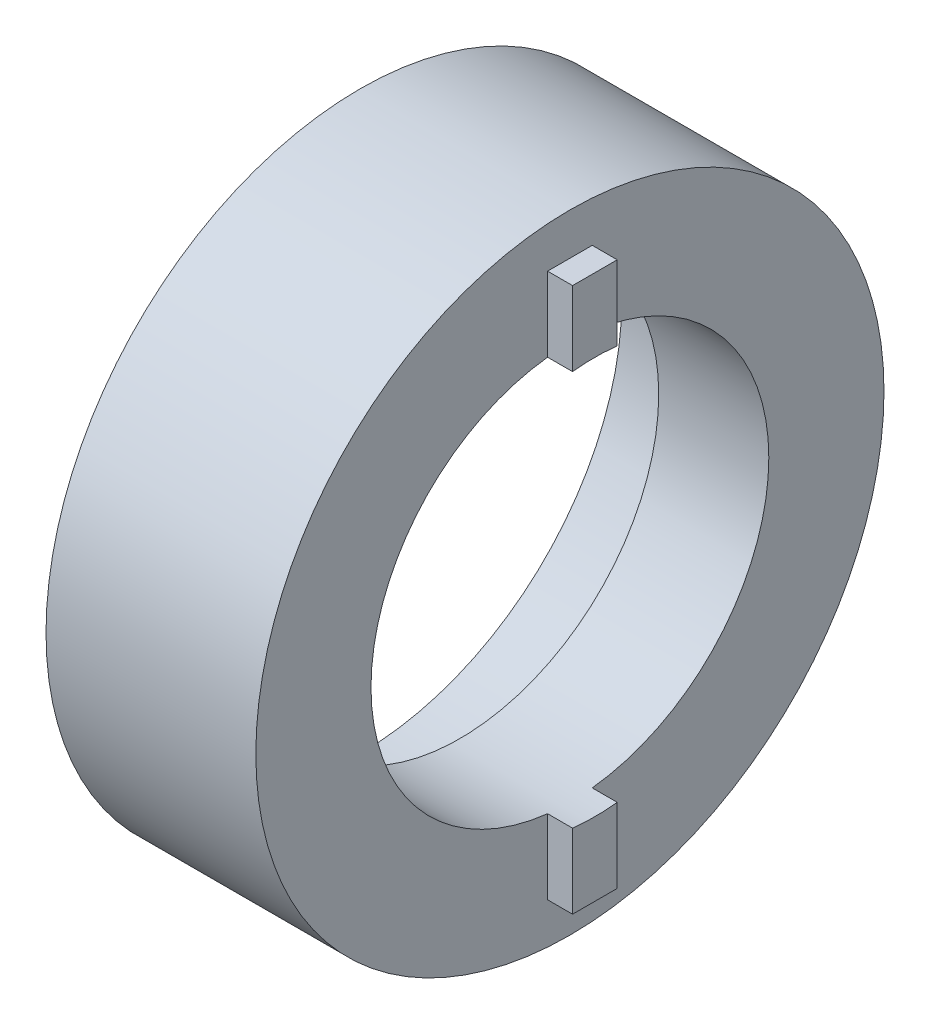
ISO-10303-21;
HEADER;
FILE_DESCRIPTION(('STEP AP214'),'2;1');
FILE_NAME('part.step','',(''),(''),'','','');
FILE_SCHEMA(('AUTOMOTIVE_DESIGN { 1 0 10303 214 1 1 1 1 }'));
ENDSEC;
DATA;
#1=APPLICATION_CONTEXT('core data for automotive mechanical design processes');
#2=APPLICATION_PROTOCOL_DEFINITION('international standard','automotive_design',2000,#1);
#3=PRODUCT_CONTEXT('',#1,'mechanical');
#4=PRODUCT('Part','Part','',(#3));
#5=PRODUCT_RELATED_PRODUCT_CATEGORY('part','',(#4));
#6=PRODUCT_DEFINITION_FORMATION('','',#4);
#7=PRODUCT_DEFINITION_CONTEXT('part definition',#1,'design');
#8=PRODUCT_DEFINITION('design','',#6,#7);
#9=PRODUCT_DEFINITION_SHAPE('','',#8);
#10=(LENGTH_UNIT() NAMED_UNIT(*) SI_UNIT(.MILLI.,.METRE.));
#11=(NAMED_UNIT(*) PLANE_ANGLE_UNIT() SI_UNIT($,.RADIAN.));
#12=(NAMED_UNIT(*) SI_UNIT($,.STERADIAN.) SOLID_ANGLE_UNIT());
#13=UNCERTAINTY_MEASURE_WITH_UNIT(LENGTH_MEASURE(1.E-05),#10,'distance_accuracy_value','');
#14=(GEOMETRIC_REPRESENTATION_CONTEXT(3) GLOBAL_UNCERTAINTY_ASSIGNED_CONTEXT((#13)) GLOBAL_UNIT_ASSIGNED_CONTEXT((#10,
#11,#12)) REPRESENTATION_CONTEXT('',''));
#15=CARTESIAN_POINT('',(0.,0.,0.));
#16=DIRECTION('',(0.,0.,1.));
#17=DIRECTION('',(1.,0.,0.));
#18=AXIS2_PLACEMENT_3D('',#15,#16,#17);
#19=CARTESIAN_POINT('',(22.4282,26.,2.1336));
#20=DIRECTION('',(0.,0.,-1.));
#21=DIRECTION('',(0.,1.,0.));
#22=AXIS2_PLACEMENT_3D('',#19,#20,#21);
#23=PLANE('',#22);
#24=DIRECTION('',(0.,-1.,0.));
#25=VECTOR('',#24,1.);
#26=CARTESIAN_POINT('',(22.4282,26.,2.1336));
#27=LINE('',#26,#25);
#28=CARTESIAN_POINT('',(22.4282,-18.8798239144331,2.1336));
#29=VERTEX_POINT('',#28);
#30=CARTESIAN_POINT('',(22.4282,-26.,2.1336));
#31=VERTEX_POINT('',#30);
#32=EDGE_CURVE('E128',#29,#31,#27,.T.);
#33=ORIENTED_EDGE('',*,*,#32,.F.);
#34=DIRECTION('',(-1.,0.,0.));
#35=VECTOR('',#34,1.);
#36=CARTESIAN_POINT('',(22.4282,-18.8798239144331,2.1336));
#37=LINE('',#36,#35);
#38=CARTESIAN_POINT('',(20.0406,-18.8798239144331,2.1336));
#39=VERTEX_POINT('',#38);
#40=EDGE_CURVE('E53',#29,#39,#37,.T.);
#41=ORIENTED_EDGE('',*,*,#40,.T.);
#42=DIRECTION('',(0.,-1.,0.));
#43=VECTOR('',#42,1.);
#44=CARTESIAN_POINT('',(20.0406,26.,2.1336));
#45=LINE('',#44,#43);
#46=CARTESIAN_POINT('',(20.0406,-26.,2.1336));
#47=VERTEX_POINT('',#46);
#48=EDGE_CURVE('E144',#39,#47,#45,.T.);
#49=ORIENTED_EDGE('',*,*,#48,.T.);
#50=DIRECTION('',(-1.,0.,0.));
#51=VECTOR('',#50,1.);
#52=CARTESIAN_POINT('',(22.4282,-26.,2.1336));
#53=LINE('',#52,#51);
#54=EDGE_CURVE('E156',#31,#47,#53,.T.);
#55=ORIENTED_EDGE('',*,*,#54,.F.);
#56=EDGE_LOOP('',(#33,#41,#49,#55));
#57=FACE_BOUND('',#56,.T.);
#58=ADVANCED_FACE('F38',(#57),#23,.F.);
#59=CARTESIAN_POINT('',(22.4282,26.,-2.1336));
#60=DIRECTION('',(0.,0.,1.));
#61=DIRECTION('',(0.,-1.,0.));
#62=AXIS2_PLACEMENT_3D('',#59,#60,#61);
#63=PLANE('',#62);
#64=DIRECTION('',(0.,1.,0.));
#65=VECTOR('',#64,1.);
#66=CARTESIAN_POINT('',(22.4282,26.,-2.1336));
#67=LINE('',#66,#65);
#68=CARTESIAN_POINT('',(22.4282,18.8798239144331,-2.1336));
#69=VERTEX_POINT('',#68);
#70=CARTESIAN_POINT('',(22.4282,26.,-2.1336));
#71=VERTEX_POINT('',#70);
#72=EDGE_CURVE('E130',#69,#71,#67,.T.);
#73=ORIENTED_EDGE('',*,*,#72,.F.);
#74=DIRECTION('',(-1.,0.,0.));
#75=VECTOR('',#74,1.);
#76=CARTESIAN_POINT('',(22.4282,18.8798239144331,-2.1336));
#77=LINE('',#76,#75);
#78=CARTESIAN_POINT('',(20.0406,18.8798239144331,-2.1336));
#79=VERTEX_POINT('',#78);
#80=EDGE_CURVE('E107',#69,#79,#77,.T.);
#81=ORIENTED_EDGE('',*,*,#80,.T.);
#82=DIRECTION('',(0.,1.,0.));
#83=VECTOR('',#82,1.);
#84=CARTESIAN_POINT('',(20.0406,26.,-2.1336));
#85=LINE('',#84,#83);
#86=CARTESIAN_POINT('',(20.0406,26.,-2.1336));
#87=VERTEX_POINT('',#86);
#88=EDGE_CURVE('E60',#79,#87,#85,.T.);
#89=ORIENTED_EDGE('',*,*,#88,.T.);
#90=DIRECTION('',(-1.,0.,0.));
#91=VECTOR('',#90,1.);
#92=CARTESIAN_POINT('',(22.4282,26.,-2.1336));
#93=LINE('',#92,#91);
#94=EDGE_CURVE('E151',#71,#87,#93,.T.);
#95=ORIENTED_EDGE('',*,*,#94,.F.);
#96=EDGE_LOOP('',(#73,#81,#89,#95));
#97=FACE_BOUND('',#96,.T.);
#98=ADVANCED_FACE('F187',(#97),#63,.F.);
#99=CARTESIAN_POINT('',(22.4282,-26.,2.1336));
#100=DIRECTION('',(-1.,0.,0.));
#101=DIRECTION('',(0.,0.,1.));
#102=AXIS2_PLACEMENT_3D('',#99,#100,#101);
#103=PLANE('',#102);
#104=CARTESIAN_POINT('',(22.4282,26.,2.1336));
#105=VERTEX_POINT('',#104);
#106=CARTESIAN_POINT('',(22.4282,18.8798239144331,2.1336));
#107=VERTEX_POINT('',#106);
#108=EDGE_CURVE('E118',#105,#107,#27,.T.);
#109=ORIENTED_EDGE('',*,*,#108,.T.);
#110=CARTESIAN_POINT('',(22.4282,0.,0.));
#111=DIRECTION('',(-1.,0.,0.));
#112=DIRECTION('',(0.,0.,1.));
#113=AXIS2_PLACEMENT_3D('',#110,#111,#112);
#114=CIRCLE('',#113,19.);
#115=EDGE_CURVE('E102',#107,#69,#114,.T.);
#116=ORIENTED_EDGE('',*,*,#115,.T.);
#117=ORIENTED_EDGE('',*,*,#72,.T.);
#118=DIRECTION('',(0.,0.,1.));
#119=VECTOR('',#118,1.);
#120=CARTESIAN_POINT('',(22.4282,26.,-2.1336));
#121=LINE('',#120,#119);
#122=EDGE_CURVE('E125',#71,#105,#121,.T.);
#123=ORIENTED_EDGE('',*,*,#122,.T.);
#124=EDGE_LOOP('',(#109,#116,#117,#123));
#125=FACE_BOUND('',#124,.T.);
#126=ADVANCED_FACE('F123',(#125),#103,.F.);
#127=CARTESIAN_POINT('',(20.0406,0.,0.));
#128=DIRECTION('',(1.,0.,0.));
#129=DIRECTION('',(0.,0.,-1.));
#130=AXIS2_PLACEMENT_3D('',#127,#128,#129);
#131=PLANE('',#130);
#132=CARTESIAN_POINT('',(20.0406,0.,0.));
#133=DIRECTION('',(1.,0.,0.));
#134=DIRECTION('',(0.,0.,-1.));
#135=AXIS2_PLACEMENT_3D('',#132,#133,#134);
#136=CIRCLE('',#135,19.);
#137=CARTESIAN_POINT('',(20.0406,18.8798239144331,2.1336));
#138=VERTEX_POINT('',#137);
#139=EDGE_CURVE('E121',#138,#39,#136,.T.);
#140=ORIENTED_EDGE('',*,*,#139,.F.);
#141=CARTESIAN_POINT('',(20.0406,26.,2.1336));
#142=VERTEX_POINT('',#141);
#143=EDGE_CURVE('E120',#142,#138,#45,.T.);
#144=ORIENTED_EDGE('',*,*,#143,.F.);
#145=DIRECTION('',(0.,0.,1.));
#146=VECTOR('',#145,1.);
#147=CARTESIAN_POINT('',(20.0406,26.,-2.1336));
#148=LINE('',#147,#146);
#149=EDGE_CURVE('E132',#87,#142,#148,.T.);
#150=ORIENTED_EDGE('',*,*,#149,.F.);
#151=ORIENTED_EDGE('',*,*,#88,.F.);
#152=CARTESIAN_POINT('',(20.0406,-18.8798239144331,-2.1336));
#153=VERTEX_POINT('',#152);
#154=EDGE_CURVE('E223',#153,#79,#136,.T.);
#155=ORIENTED_EDGE('',*,*,#154,.F.);
#156=CARTESIAN_POINT('',(20.0406,-26.,-2.1336));
#157=VERTEX_POINT('',#156);
#158=EDGE_CURVE('E146',#157,#153,#85,.T.);
#159=ORIENTED_EDGE('',*,*,#158,.F.);
#160=DIRECTION('',(0.,0.,-1.));
#161=VECTOR('',#160,1.);
#162=CARTESIAN_POINT('',(20.0406,-26.,-2.1336));
#163=LINE('',#162,#161);
#164=EDGE_CURVE('E143',#47,#157,#163,.T.);
#165=ORIENTED_EDGE('',*,*,#164,.F.);
#166=ORIENTED_EDGE('',*,*,#48,.F.);
#167=EDGE_LOOP('',(#140,#144,#150,#151,#155,#159,#165,#166));
#168=FACE_BOUND('',#167,.T.);
#169=CARTESIAN_POINT('',(20.0406,0.,0.));
#170=DIRECTION('',(1.,0.,0.));
#171=DIRECTION('',(0.,0.,-1.));
#172=AXIS2_PLACEMENT_3D('',#169,#170,#171);
#173=CIRCLE('',#172,30.);
#174=CARTESIAN_POINT('',(20.0406,0.,30.));
#175=VERTEX_POINT('',#174);
#176=EDGE_CURVE('E46',#175,#175,#173,.T.);
#177=ORIENTED_EDGE('',*,*,#176,.T.);
#178=EDGE_LOOP('',(#177));
#179=FACE_BOUND('',#178,.T.);
#180=ADVANCED_FACE('F182',(#168,#179),#131,.T.);
#181=CARTESIAN_POINT('',(20.0406,0.,0.));
#182=DIRECTION('',(-1.,0.,0.));
#183=DIRECTION('',(0.,0.,1.));
#184=AXIS2_PLACEMENT_3D('',#181,#182,#183);
#185=CYLINDRICAL_SURFACE('',#184,30.);
#186=CARTESIAN_POINT('',(0.,0.,0.));
#187=DIRECTION('',(1.,0.,0.));
#188=DIRECTION('',(0.,0.,-1.));
#189=AXIS2_PLACEMENT_3D('',#186,#187,#188);
#190=CIRCLE('',#189,30.);
#191=CARTESIAN_POINT('',(0.,0.,30.));
#192=VERTEX_POINT('',#191);
#193=EDGE_CURVE('E163',#192,#192,#190,.T.);
#194=CARTESIAN_POINT('',(20.0406,0.,30.));
#195=CARTESIAN_POINT('',(19.83184375,0.,30.));
#196=CARTESIAN_POINT('',(19.6230875,0.,30.));
#197=CARTESIAN_POINT('',(19.205575,0.,30.));
#198=CARTESIAN_POINT('',(18.99681875,0.,30.));
#199=CARTESIAN_POINT('',(18.57930625,0.,30.));
#200=CARTESIAN_POINT('',(18.37055,0.,30.));
#201=CARTESIAN_POINT('',(17.9530375,0.,30.));
#202=CARTESIAN_POINT('',(17.74428125,0.,30.));
#203=CARTESIAN_POINT('',(17.32676875,0.,30.));
#204=CARTESIAN_POINT('',(17.1180125,0.,30.));
#205=CARTESIAN_POINT('',(16.7005,0.,30.));
#206=CARTESIAN_POINT('',(16.49174375,0.,30.));
#207=CARTESIAN_POINT('',(16.07423125,0.,30.));
#208=CARTESIAN_POINT('',(15.865475,0.,30.));
#209=CARTESIAN_POINT('',(15.4479625,0.,30.));
#210=CARTESIAN_POINT('',(15.23920625,0.,30.));
#211=CARTESIAN_POINT('',(14.82169375,0.,30.));
#212=CARTESIAN_POINT('',(14.6129375,0.,30.));
#213=CARTESIAN_POINT('',(14.195425,0.,30.));
#214=CARTESIAN_POINT('',(13.98666875,0.,30.));
#215=CARTESIAN_POINT('',(13.56915625,0.,30.));
#216=CARTESIAN_POINT('',(13.3604,0.,30.));
#217=CARTESIAN_POINT('',(12.9428875,0.,30.));
#218=CARTESIAN_POINT('',(12.73413125,0.,30.));
#219=CARTESIAN_POINT('',(12.31661875,0.,30.));
#220=CARTESIAN_POINT('',(12.1078625,0.,30.));
#221=CARTESIAN_POINT('',(11.69035,0.,30.));
#222=CARTESIAN_POINT('',(11.48159375,0.,30.));
#223=CARTESIAN_POINT('',(11.06408125,0.,30.));
#224=CARTESIAN_POINT('',(10.855325,0.,30.));
#225=CARTESIAN_POINT('',(10.4378125,0.,30.));
#226=CARTESIAN_POINT('',(10.22905625,0.,30.));
#227=CARTESIAN_POINT('',(9.81154374999999,0.,30.));
#228=CARTESIAN_POINT('',(9.6027875,0.,30.));
#229=CARTESIAN_POINT('',(9.18527499999999,0.,30.));
#230=CARTESIAN_POINT('',(8.97651874999999,0.,30.));
#231=CARTESIAN_POINT('',(8.55900625,0.,30.));
#232=CARTESIAN_POINT('',(8.35025,0.,30.));
#233=CARTESIAN_POINT('',(7.93273749999999,0.,30.));
#234=CARTESIAN_POINT('',(7.72398125,0.,30.));
#235=CARTESIAN_POINT('',(7.30646875,0.,30.));
#236=CARTESIAN_POINT('',(7.09771249999999,0.,30.));
#237=CARTESIAN_POINT('',(6.68019999999999,0.,30.));
#238=CARTESIAN_POINT('',(6.47144375,0.,30.));
#239=CARTESIAN_POINT('',(6.05393125,0.,30.));
#240=CARTESIAN_POINT('',(5.84517499999999,0.,30.));
#241=CARTESIAN_POINT('',(5.42766249999999,0.,30.));
#242=CARTESIAN_POINT('',(5.21890624999999,0.,30.));
#243=CARTESIAN_POINT('',(4.80139375,0.,30.));
#244=CARTESIAN_POINT('',(4.5926375,0.,30.));
#245=CARTESIAN_POINT('',(4.175125,0.,30.));
#246=CARTESIAN_POINT('',(3.96636875,0.,30.));
#247=CARTESIAN_POINT('',(3.54885625,0.,30.));
#248=CARTESIAN_POINT('',(3.3401,0.,30.));
#249=CARTESIAN_POINT('',(2.9225875,0.,30.));
#250=CARTESIAN_POINT('',(2.71383125,0.,30.));
#251=CARTESIAN_POINT('',(2.29631875,0.,30.));
#252=CARTESIAN_POINT('',(2.0875625,0.,30.));
#253=CARTESIAN_POINT('',(1.67005,0.,30.));
#254=CARTESIAN_POINT('',(1.46129375,0.,30.));
#255=CARTESIAN_POINT('',(1.04378125,0.,30.));
#256=CARTESIAN_POINT('',(0.835024999999996,0.,30.));
#257=CARTESIAN_POINT('',(0.417512499999996,0.,30.));
#258=CARTESIAN_POINT('',(0.208756249999996,0.,30.));
#259=CARTESIAN_POINT('',(0.,0.,30.));
#260=B_SPLINE_CURVE_WITH_KNOTS('',3,(#194,#195,#196,#197,#198,#199,#200,#201,#202,#203,#204,
#205,#206,#207,#208,#209,#210,#211,#212,#213,#214,#215,#216,#217,#218,#219,#220,#221,#222,#223,
#224,#225,#226,#227,#228,#229,#230,#231,#232,#233,#234,#235,#236,#237,#238,#239,#240,#241,#242,
#243,#244,#245,#246,#247,#248,#249,#250,#251,#252,#253,#254,#255,#256,#257,#258,#259),
.UNSPECIFIED.,.F.,.F.,(4,2,2,2,2,2,2,2,2,2,2,2,2,2,2,2,2,2,2,2,2,2,2,2,2,2,2,2,2,2,2,2,4),(0.,
0.626268750000002,1.2525375,1.87880625,2.505075,3.13134375,3.7576125,4.38388125,5.01015,
5.63641875,6.2626875,6.88895625,7.515225,8.14149375,8.7677625,9.39403125,10.0203,10.64656875,
11.2728375,11.89910625,12.525375,13.15164375,13.7779125,14.40418125,15.03045,15.65671875,
16.2829875,16.90925625,17.535525,18.16179375,18.7880625,19.41433125,20.0406),.UNSPECIFIED.);
#261=EDGE_CURVE('BSEAM40',#175,#192,#260,.T.);
#262=ORIENTED_EDGE('',*,*,#176,.F.);
#263=ORIENTED_EDGE('',*,*,#193,.T.);
#264=ORIENTED_EDGE('',*,*,#261,.T.);
#265=ORIENTED_EDGE('',*,*,#261,.F.);
#266=EDGE_LOOP('',(#262,#264,#263,#265));
#267=FACE_BOUND('',#266,.T.);
#268=ADVANCED_FACE('F40',(#267),#185,.T.);
#269=CARTESIAN_POINT('',(0.,0.,0.));
#270=DIRECTION('',(1.,0.,0.));
#271=DIRECTION('',(0.,0.,-1.));
#272=AXIS2_PLACEMENT_3D('',#269,#270,#271);
#273=PLANE('',#272);
#274=CARTESIAN_POINT('',(0.,0.,0.));
#275=DIRECTION('',(-1.,0.,0.));
#276=DIRECTION('',(0.,0.,1.));
#277=AXIS2_PLACEMENT_3D('',#274,#275,#276);
#278=CIRCLE('',#277,25.);
#279=CARTESIAN_POINT('',(0.,0.,25.));
#280=VERTEX_POINT('',#279);
#281=EDGE_CURVE('E159',#280,#280,#278,.T.);
#282=ORIENTED_EDGE('',*,*,#281,.F.);
#283=EDGE_LOOP('',(#282));
#284=FACE_BOUND('',#283,.T.);
#285=ORIENTED_EDGE('',*,*,#193,.F.);
#286=EDGE_LOOP('',(#285));
#287=FACE_BOUND('',#286,.T.);
#288=ADVANCED_FACE('F171',(#284,#287),#273,.F.);
#289=CARTESIAN_POINT('',(9.525,0.,0.));
#290=DIRECTION('',(-1.,0.,0.));
#291=DIRECTION('',(0.,0.,1.));
#292=AXIS2_PLACEMENT_3D('',#289,#290,#291);
#293=CYLINDRICAL_SURFACE('',#292,25.);
#294=CARTESIAN_POINT('',(9.525,0.,0.));
#295=DIRECTION('',(-1.,0.,0.));
#296=DIRECTION('',(0.,0.,1.));
#297=AXIS2_PLACEMENT_3D('',#294,#295,#296);
#298=CIRCLE('',#297,25.);
#299=CARTESIAN_POINT('',(9.525,0.,25.));
#300=VERTEX_POINT('',#299);
#301=EDGE_CURVE('E160',#300,#300,#298,.T.);
#302=CARTESIAN_POINT('',(9.525,0.,25.));
#303=CARTESIAN_POINT('',(9.42578125,0.,25.));
#304=CARTESIAN_POINT('',(9.3265625,0.,25.));
#305=CARTESIAN_POINT('',(9.128125,0.,25.));
#306=CARTESIAN_POINT('',(9.02890625,0.,25.));
#307=CARTESIAN_POINT('',(8.83046875,0.,25.));
#308=CARTESIAN_POINT('',(8.73125,0.,25.));
#309=CARTESIAN_POINT('',(8.5328125,0.,25.));
#310=CARTESIAN_POINT('',(8.43359375,0.,25.));
#311=CARTESIAN_POINT('',(8.23515625,0.,25.));
#312=CARTESIAN_POINT('',(8.1359375,0.,25.));
#313=CARTESIAN_POINT('',(7.9375,0.,25.));
#314=CARTESIAN_POINT('',(7.83828125,0.,25.));
#315=CARTESIAN_POINT('',(7.63984375,0.,25.));
#316=CARTESIAN_POINT('',(7.540625,0.,25.));
#317=CARTESIAN_POINT('',(7.3421875,0.,25.));
#318=CARTESIAN_POINT('',(7.24296875,0.,25.));
#319=CARTESIAN_POINT('',(7.04453125,0.,25.));
#320=CARTESIAN_POINT('',(6.9453125,0.,25.));
#321=CARTESIAN_POINT('',(6.746875,0.,25.));
#322=CARTESIAN_POINT('',(6.64765625,0.,25.));
#323=CARTESIAN_POINT('',(6.44921875,0.,25.));
#324=CARTESIAN_POINT('',(6.35,0.,25.));
#325=CARTESIAN_POINT('',(6.1515625,0.,25.));
#326=CARTESIAN_POINT('',(6.05234375,0.,25.));
#327=CARTESIAN_POINT('',(5.85390625,0.,25.));
#328=CARTESIAN_POINT('',(5.7546875,0.,25.));
#329=CARTESIAN_POINT('',(5.55625,0.,25.));
#330=CARTESIAN_POINT('',(5.45703125,0.,25.));
#331=CARTESIAN_POINT('',(5.25859375,0.,25.));
#332=CARTESIAN_POINT('',(5.159375,0.,25.));
#333=CARTESIAN_POINT('',(4.9609375,0.,25.));
#334=CARTESIAN_POINT('',(4.86171875,0.,25.));
#335=CARTESIAN_POINT('',(4.66328125,0.,25.));
#336=CARTESIAN_POINT('',(4.5640625,0.,25.));
#337=CARTESIAN_POINT('',(4.365625,0.,25.));
#338=CARTESIAN_POINT('',(4.26640625,0.,25.));
#339=CARTESIAN_POINT('',(4.06796875,0.,25.));
#340=CARTESIAN_POINT('',(3.96875,0.,25.));
#341=CARTESIAN_POINT('',(3.7703125,0.,25.));
#342=CARTESIAN_POINT('',(3.67109375,0.,25.));
#343=CARTESIAN_POINT('',(3.47265625,0.,25.));
#344=CARTESIAN_POINT('',(3.3734375,0.,25.));
#345=CARTESIAN_POINT('',(3.175,0.,25.));
#346=CARTESIAN_POINT('',(3.07578125,0.,25.));
#347=CARTESIAN_POINT('',(2.87734375,0.,25.));
#348=CARTESIAN_POINT('',(2.778125,0.,25.));
#349=CARTESIAN_POINT('',(2.5796875,0.,25.));
#350=CARTESIAN_POINT('',(2.48046875,0.,25.));
#351=CARTESIAN_POINT('',(2.28203125,0.,25.));
#352=CARTESIAN_POINT('',(2.1828125,0.,25.));
#353=CARTESIAN_POINT('',(1.984375,0.,25.));
#354=CARTESIAN_POINT('',(1.88515625,0.,25.));
#355=CARTESIAN_POINT('',(1.68671875,0.,25.));
#356=CARTESIAN_POINT('',(1.5875,0.,25.));
#357=CARTESIAN_POINT('',(1.3890625,0.,25.));
#358=CARTESIAN_POINT('',(1.28984375,0.,25.));
#359=CARTESIAN_POINT('',(1.09140625,0.,25.));
#360=CARTESIAN_POINT('',(0.992187500000001,0.,25.));
#361=CARTESIAN_POINT('',(0.793750000000001,0.,25.));
#362=CARTESIAN_POINT('',(0.69453125,0.,25.));
#363=CARTESIAN_POINT('',(0.49609375,0.,25.));
#364=CARTESIAN_POINT('',(0.396875,0.,25.));
#365=CARTESIAN_POINT('',(0.1984375,0.,25.));
#366=CARTESIAN_POINT('',(0.0992187500000001,0.,25.));
#367=CARTESIAN_POINT('',(0.,0.,25.));
#368=B_SPLINE_CURVE_WITH_KNOTS('',3,(#302,#303,#304,#305,#306,#307,#308,#309,#310,#311,#312,
#313,#314,#315,#316,#317,#318,#319,#320,#321,#322,#323,#324,#325,#326,#327,#328,#329,#330,#331,
#332,#333,#334,#335,#336,#337,#338,#339,#340,#341,#342,#343,#344,#345,#346,#347,#348,#349,#350,
#351,#352,#353,#354,#355,#356,#357,#358,#359,#360,#361,#362,#363,#364,#365,#366,#367),
.UNSPECIFIED.,.F.,.F.,(4,2,2,2,2,2,2,2,2,2,2,2,2,2,2,2,2,2,2,2,2,2,2,2,2,2,2,2,2,2,2,2,4),(0.,
0.29765625,0.5953125,0.892968750000001,1.190625,1.48828125,1.7859375,2.08359375,2.38125,
2.67890625,2.9765625,3.27421875,3.571875,3.86953125,4.1671875,4.46484375,4.7625,5.06015625,
5.3578125,5.65546875,5.953125,6.25078125,6.5484375,6.84609375,7.14375,7.44140625,7.7390625,
8.03671875,8.334375,8.63203125,8.9296875,9.22734375,9.525),.UNSPECIFIED.);
#369=EDGE_CURVE('BSEAM173',#300,#280,#368,.T.);
#370=ORIENTED_EDGE('',*,*,#301,.F.);
#371=ORIENTED_EDGE('',*,*,#281,.T.);
#372=ORIENTED_EDGE('',*,*,#369,.T.);
#373=ORIENTED_EDGE('',*,*,#369,.F.);
#374=EDGE_LOOP('',(#370,#372,#371,#373));
#375=FACE_BOUND('',#374,.T.);
#376=ADVANCED_FACE('F173',(#375),#293,.F.);
#377=CARTESIAN_POINT('',(9.525,0.,0.));
#378=DIRECTION('',(-1.,0.,0.));
#379=DIRECTION('',(0.,0.,1.));
#380=AXIS2_PLACEMENT_3D('',#377,#378,#379);
#381=PLANE('',#380);
#382=CARTESIAN_POINT('',(9.525,0.,0.));
#383=DIRECTION('',(-1.,0.,0.));
#384=DIRECTION('',(0.,0.,1.));
#385=AXIS2_PLACEMENT_3D('',#382,#383,#384);
#386=CIRCLE('',#385,19.);
#387=CARTESIAN_POINT('',(9.525,0.,19.));
#388=VERTEX_POINT('',#387);
#389=EDGE_CURVE('E134',#388,#388,#386,.T.);
#390=ORIENTED_EDGE('',*,*,#389,.F.);
#391=EDGE_LOOP('',(#390));
#392=FACE_BOUND('',#391,.T.);
#393=ORIENTED_EDGE('',*,*,#301,.T.);
#394=EDGE_LOOP('',(#393));
#395=FACE_BOUND('',#394,.T.);
#396=ADVANCED_FACE('F179',(#392,#395),#381,.T.);
#397=ORIENTED_EDGE('',*,*,#143,.T.);
#398=DIRECTION('',(-1.,0.,0.));
#399=VECTOR('',#398,1.);
#400=CARTESIAN_POINT('',(22.4282,18.8798239144331,2.1336));
#401=LINE('',#400,#399);
#402=EDGE_CURVE('E105',#138,#107,#401,.F.);
#403=ORIENTED_EDGE('',*,*,#402,.T.);
#404=ORIENTED_EDGE('',*,*,#108,.F.);
#405=DIRECTION('',(-1.,0.,0.));
#406=VECTOR('',#405,1.);
#407=CARTESIAN_POINT('',(22.4282,26.,2.1336));
#408=LINE('',#407,#406);
#409=EDGE_CURVE('E141',#105,#142,#408,.T.);
#410=ORIENTED_EDGE('',*,*,#409,.T.);
#411=EDGE_LOOP('',(#397,#403,#404,#410));
#412=FACE_BOUND('',#411,.T.);
#413=ADVANCED_FACE('F116',(#412),#23,.F.);
#414=CARTESIAN_POINT('',(22.4282,-26.,-2.1336));
#415=DIRECTION('',(0.,1.,0.));
#416=DIRECTION('',(0.,0.,1.));
#417=AXIS2_PLACEMENT_3D('',#414,#415,#416);
#418=PLANE('',#417);
#419=ORIENTED_EDGE('',*,*,#164,.T.);
#420=DIRECTION('',(-1.,0.,0.));
#421=VECTOR('',#420,1.);
#422=CARTESIAN_POINT('',(22.4282,-26.,-2.1336));
#423=LINE('',#422,#421);
#424=CARTESIAN_POINT('',(22.4282,-26.,-2.1336));
#425=VERTEX_POINT('',#424);
#426=EDGE_CURVE('E153',#425,#157,#423,.T.);
#427=ORIENTED_EDGE('',*,*,#426,.F.);
#428=DIRECTION('',(0.,0.,-1.));
#429=VECTOR('',#428,1.);
#430=CARTESIAN_POINT('',(22.4282,-26.,-2.1336));
#431=LINE('',#430,#429);
#432=EDGE_CURVE('E127',#31,#425,#431,.T.);
#433=ORIENTED_EDGE('',*,*,#432,.F.);
#434=ORIENTED_EDGE('',*,*,#54,.T.);
#435=EDGE_LOOP('',(#419,#427,#433,#434));
#436=FACE_BOUND('',#435,.T.);
#437=ADVANCED_FACE('F199',(#436),#418,.F.);
#438=ORIENTED_EDGE('',*,*,#158,.T.);
#439=DIRECTION('',(-1.,0.,0.));
#440=VECTOR('',#439,1.);
#441=CARTESIAN_POINT('',(22.4282,-18.8798239144331,-2.1336));
#442=LINE('',#441,#440);
#443=CARTESIAN_POINT('',(22.4282,-18.8798239144331,-2.1336));
#444=VERTEX_POINT('',#443);
#445=EDGE_CURVE('E111',#153,#444,#442,.F.);
#446=ORIENTED_EDGE('',*,*,#445,.T.);
#447=EDGE_CURVE('E137',#425,#444,#67,.T.);
#448=ORIENTED_EDGE('',*,*,#447,.F.);
#449=ORIENTED_EDGE('',*,*,#426,.T.);
#450=EDGE_LOOP('',(#438,#446,#448,#449));
#451=FACE_BOUND('',#450,.T.);
#452=ADVANCED_FACE('F194',(#451),#63,.F.);
#453=CARTESIAN_POINT('',(22.4282,26.,-2.1336));
#454=DIRECTION('',(0.,-1.,0.));
#455=DIRECTION('',(0.,0.,-1.));
#456=AXIS2_PLACEMENT_3D('',#453,#454,#455);
#457=PLANE('',#456);
#458=ORIENTED_EDGE('',*,*,#149,.T.);
#459=ORIENTED_EDGE('',*,*,#409,.F.);
#460=ORIENTED_EDGE('',*,*,#122,.F.);
#461=ORIENTED_EDGE('',*,*,#94,.T.);
#462=EDGE_LOOP('',(#458,#459,#460,#461));
#463=FACE_BOUND('',#462,.T.);
#464=ADVANCED_FACE('F236',(#463),#457,.F.);
#465=ORIENTED_EDGE('',*,*,#447,.T.);
#466=CARTESIAN_POINT('',(22.4282,0.,0.));
#467=DIRECTION('',(-1.,0.,0.));
#468=DIRECTION('',(0.,0.,1.));
#469=AXIS2_PLACEMENT_3D('',#466,#467,#468);
#470=CIRCLE('',#469,19.);
#471=EDGE_CURVE('E11',#444,#29,#470,.T.);
#472=ORIENTED_EDGE('',*,*,#471,.T.);
#473=ORIENTED_EDGE('',*,*,#32,.T.);
#474=ORIENTED_EDGE('',*,*,#432,.T.);
#475=EDGE_LOOP('',(#465,#472,#473,#474));
#476=FACE_BOUND('',#475,.T.);
#477=ADVANCED_FACE('F216',(#476),#103,.F.);
#478=CARTESIAN_POINT('',(22.4282,0.,0.));
#479=DIRECTION('',(-1.,0.,0.));
#480=DIRECTION('',(0.,0.,1.));
#481=AXIS2_PLACEMENT_3D('',#478,#479,#480);
#482=CYLINDRICAL_SURFACE('',#481,19.);
#483=ORIENTED_EDGE('',*,*,#389,.T.);
#484=EDGE_LOOP('',(#483));
#485=FACE_BOUND('',#484,.T.);
#486=ORIENTED_EDGE('',*,*,#471,.F.);
#487=ORIENTED_EDGE('',*,*,#445,.F.);
#488=ORIENTED_EDGE('',*,*,#154,.T.);
#489=ORIENTED_EDGE('',*,*,#80,.F.);
#490=ORIENTED_EDGE('',*,*,#115,.F.);
#491=ORIENTED_EDGE('',*,*,#402,.F.);
#492=ORIENTED_EDGE('',*,*,#139,.T.);
#493=ORIENTED_EDGE('',*,*,#40,.F.);
#494=EDGE_LOOP('',(#486,#487,#488,#489,#490,#491,#492,#493));
#495=FACE_BOUND('',#494,.T.);
#496=ADVANCED_FACE('F104',(#485,#495),#482,.F.);
#497=CLOSED_SHELL('',(#58,#98,#126,#180,#268,#288,#376,#396,#413,#437,#452,#464,#477,#496));
#498=MANIFOLD_SOLID_BREP('B2',#497);
#499=ADVANCED_BREP_SHAPE_REPRESENTATION('',(#18,#498),#14);
#500=SHAPE_DEFINITION_REPRESENTATION(#9,#499);
ENDSEC;
END-ISO-10303-21;
